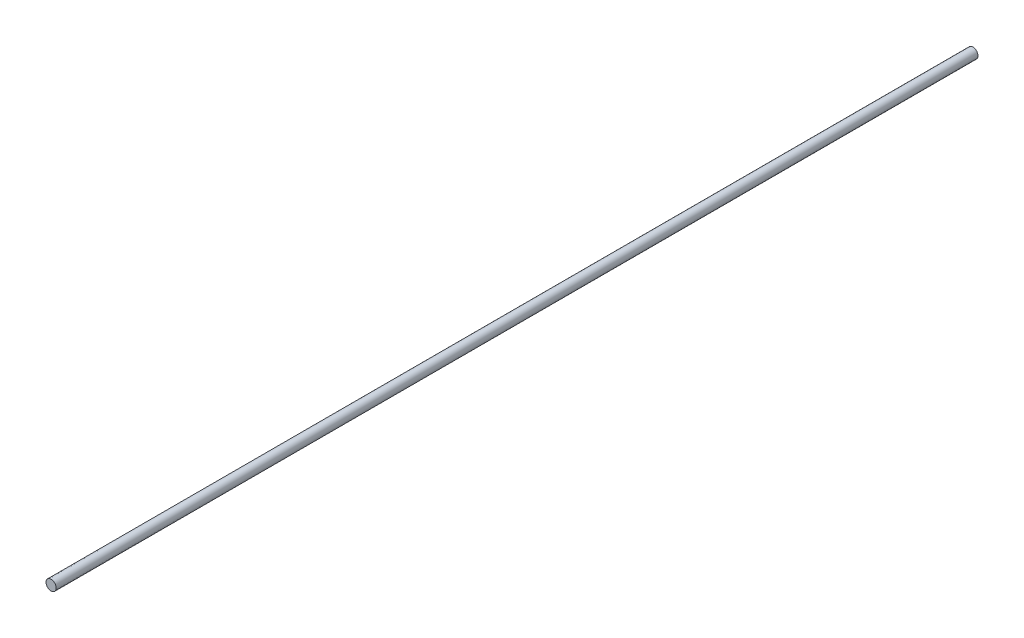
ISO-10303-21;
HEADER;
FILE_DESCRIPTION(('STEP AP214'),'2;1');
FILE_NAME('part.step','',(''),(''),'','','');
FILE_SCHEMA(('AUTOMOTIVE_DESIGN { 1 0 10303 214 1 1 1 1 }'));
ENDSEC;
DATA;
#1=APPLICATION_CONTEXT('core data for automotive mechanical design processes');
#2=APPLICATION_PROTOCOL_DEFINITION('international standard','automotive_design',2000,#1);
#3=PRODUCT_CONTEXT('',#1,'mechanical');
#4=PRODUCT('Part','Part','',(#3));
#5=PRODUCT_RELATED_PRODUCT_CATEGORY('part','',(#4));
#6=PRODUCT_DEFINITION_FORMATION('','',#4);
#7=PRODUCT_DEFINITION_CONTEXT('part definition',#1,'design');
#8=PRODUCT_DEFINITION('design','',#6,#7);
#9=PRODUCT_DEFINITION_SHAPE('','',#8);
#10=(LENGTH_UNIT() NAMED_UNIT(*) SI_UNIT(.MILLI.,.METRE.));
#11=(NAMED_UNIT(*) PLANE_ANGLE_UNIT() SI_UNIT($,.RADIAN.));
#12=(NAMED_UNIT(*) SI_UNIT($,.STERADIAN.) SOLID_ANGLE_UNIT());
#13=UNCERTAINTY_MEASURE_WITH_UNIT(LENGTH_MEASURE(1.E-05),#10,'distance_accuracy_value','');
#14=(GEOMETRIC_REPRESENTATION_CONTEXT(3) GLOBAL_UNCERTAINTY_ASSIGNED_CONTEXT((#13)) GLOBAL_UNIT_ASSIGNED_CONTEXT((#10,
#11,#12)) REPRESENTATION_CONTEXT('',''));
#15=CARTESIAN_POINT('',(0.,0.,0.));
#16=DIRECTION('',(0.,0.,1.));
#17=DIRECTION('',(1.,0.,0.));
#18=AXIS2_PLACEMENT_3D('',#15,#16,#17);
#19=CARTESIAN_POINT('',(0.,0.,400.));
#20=DIRECTION('',(0.,0.,-1.));
#21=DIRECTION('',(-1.,0.,0.));
#22=AXIS2_PLACEMENT_3D('',#19,#20,#21);
#23=CYLINDRICAL_SURFACE('',#22,2.2);
#24=CARTESIAN_POINT('',(0.,0.,400.));
#25=DIRECTION('',(0.,0.,1.));
#26=DIRECTION('',(1.,0.,0.));
#27=AXIS2_PLACEMENT_3D('',#24,#25,#26);
#28=CIRCLE('',#27,2.2);
#29=CARTESIAN_POINT('',(2.2,0.,400.));
#30=VERTEX_POINT('',#29);
#31=EDGE_CURVE('E10',#30,#30,#28,.T.);
#32=ORIENTED_EDGE('',*,*,#31,.F.);
#33=EDGE_LOOP('',(#32));
#34=FACE_BOUND('',#33,.T.);
#35=CARTESIAN_POINT('',(0.,0.,0.));
#36=DIRECTION('',(0.,0.,1.));
#37=DIRECTION('',(1.,0.,0.));
#38=AXIS2_PLACEMENT_3D('',#35,#36,#37);
#39=CIRCLE('',#38,2.2);
#40=CARTESIAN_POINT('',(2.2,0.,0.));
#41=VERTEX_POINT('',#40);
#42=EDGE_CURVE('E40',#41,#41,#39,.T.);
#43=ORIENTED_EDGE('',*,*,#42,.T.);
#44=EDGE_LOOP('',(#43));
#45=FACE_BOUND('',#44,.T.);
#46=ADVANCED_FACE('F37',(#34,#45),#23,.T.);
#47=CARTESIAN_POINT('',(0.,0.,400.));
#48=DIRECTION('',(0.,0.,1.));
#49=DIRECTION('',(1.,0.,0.));
#50=AXIS2_PLACEMENT_3D('',#47,#48,#49);
#51=PLANE('',#50);
#52=ORIENTED_EDGE('',*,*,#31,.T.);
#53=EDGE_LOOP('',(#52));
#54=FACE_BOUND('',#53,.T.);
#55=ADVANCED_FACE('F54',(#54),#51,.T.);
#56=CARTESIAN_POINT('',(0.,0.,0.));
#57=DIRECTION('',(0.,0.,1.));
#58=DIRECTION('',(1.,0.,0.));
#59=AXIS2_PLACEMENT_3D('',#56,#57,#58);
#60=PLANE('',#59);
#61=ORIENTED_EDGE('',*,*,#42,.F.);
#62=EDGE_LOOP('',(#61));
#63=FACE_BOUND('',#62,.T.);
#64=ADVANCED_FACE('F52',(#63),#60,.F.);
#65=CLOSED_SHELL('',(#46,#55,#64));
#66=MANIFOLD_SOLID_BREP('B2',#65);
#67=ADVANCED_BREP_SHAPE_REPRESENTATION('',(#18,#66),#14);
#68=SHAPE_DEFINITION_REPRESENTATION(#9,#67);
ENDSEC;
END-ISO-10303-21;
